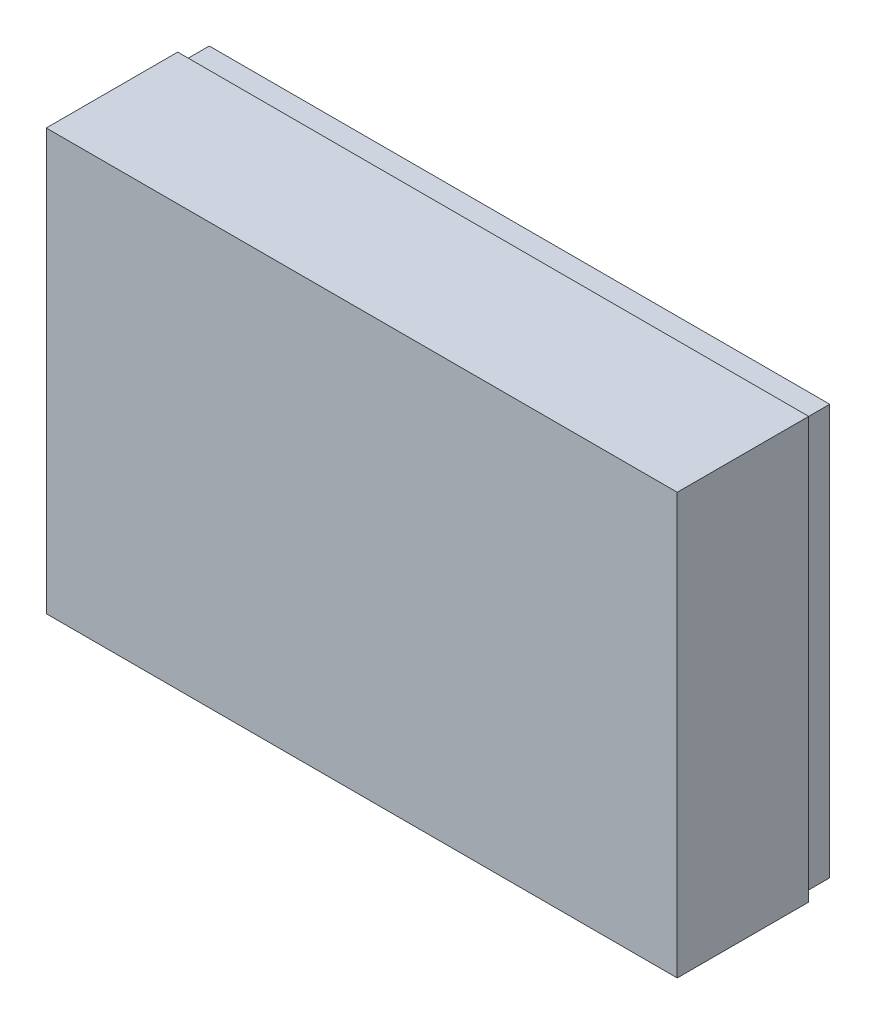
ISO-10303-21;
HEADER;
FILE_DESCRIPTION(('STEP AP214'),'2;1');
FILE_NAME('part.step','',(''),(''),'','','');
FILE_SCHEMA(('AUTOMOTIVE_DESIGN { 1 0 10303 214 1 1 1 1 }'));
ENDSEC;
DATA;
#1=APPLICATION_CONTEXT('core data for automotive mechanical design processes');
#2=APPLICATION_PROTOCOL_DEFINITION('international standard','automotive_design',2000,#1);
#3=PRODUCT_CONTEXT('',#1,'mechanical');
#4=PRODUCT('Part','Part','',(#3));
#5=PRODUCT_RELATED_PRODUCT_CATEGORY('part','',(#4));
#6=PRODUCT_DEFINITION_FORMATION('','',#4);
#7=PRODUCT_DEFINITION_CONTEXT('part definition',#1,'design');
#8=PRODUCT_DEFINITION('design','',#6,#7);
#9=PRODUCT_DEFINITION_SHAPE('','',#8);
#10=(LENGTH_UNIT() NAMED_UNIT(*) SI_UNIT(.MILLI.,.METRE.));
#11=(NAMED_UNIT(*) PLANE_ANGLE_UNIT() SI_UNIT($,.RADIAN.));
#12=(NAMED_UNIT(*) SI_UNIT($,.STERADIAN.) SOLID_ANGLE_UNIT());
#13=UNCERTAINTY_MEASURE_WITH_UNIT(LENGTH_MEASURE(1.E-05),#10,'distance_accuracy_value','');
#14=(GEOMETRIC_REPRESENTATION_CONTEXT(3) GLOBAL_UNCERTAINTY_ASSIGNED_CONTEXT((#13)) GLOBAL_UNIT_ASSIGNED_CONTEXT((#10,
#11,#12)) REPRESENTATION_CONTEXT('',''));
#15=CARTESIAN_POINT('',(0.,0.,0.));
#16=DIRECTION('',(0.,0.,1.));
#17=DIRECTION('',(1.,0.,0.));
#18=AXIS2_PLACEMENT_3D('',#15,#16,#17);
#19=CARTESIAN_POINT('',(0.,0.,0.));
#20=DIRECTION('',(0.,0.,-1.));
#21=DIRECTION('',(-1.,0.,0.));
#22=AXIS2_PLACEMENT_3D('',#19,#20,#21);
#23=PLANE('',#22);
#24=DIRECTION('',(-1.,0.,0.));
#25=VECTOR('',#24,1.);
#26=CARTESIAN_POINT('',(0.,38.,0.));
#27=LINE('',#26,#25);
#28=CARTESIAN_POINT('',(58.,38.,0.));
#29=VERTEX_POINT('',#28);
#30=CARTESIAN_POINT('',(-58.,38.,0.));
#31=VERTEX_POINT('',#30);
#32=EDGE_CURVE('E180',#29,#31,#27,.T.);
#33=ORIENTED_EDGE('',*,*,#32,.T.);
#34=DIRECTION('',(0.,-1.,0.));
#35=VECTOR('',#34,1.);
#36=CARTESIAN_POINT('',(-58.,0.,0.));
#37=LINE('',#36,#35);
#38=CARTESIAN_POINT('',(-58.,-38.,0.));
#39=VERTEX_POINT('',#38);
#40=EDGE_CURVE('E170',#31,#39,#37,.T.);
#41=ORIENTED_EDGE('',*,*,#40,.T.);
#42=DIRECTION('',(1.,0.,0.));
#43=VECTOR('',#42,1.);
#44=CARTESIAN_POINT('',(0.,-38.,0.));
#45=LINE('',#44,#43);
#46=CARTESIAN_POINT('',(58.,-38.,0.));
#47=VERTEX_POINT('',#46);
#48=EDGE_CURVE('E194',#39,#47,#45,.T.);
#49=ORIENTED_EDGE('',*,*,#48,.T.);
#50=DIRECTION('',(0.,1.,0.));
#51=VECTOR('',#50,1.);
#52=CARTESIAN_POINT('',(58.,0.,0.));
#53=LINE('',#52,#51);
#54=EDGE_CURVE('E197',#47,#29,#53,.T.);
#55=ORIENTED_EDGE('',*,*,#54,.T.);
#56=EDGE_LOOP('',(#33,#41,#49,#55));
#57=FACE_BOUND('',#56,.T.);
#58=DIRECTION('',(0.,-1.,0.));
#59=VECTOR('',#58,1.);
#60=CARTESIAN_POINT('',(59.,39.,0.));
#61=LINE('',#60,#59);
#62=CARTESIAN_POINT('',(59.,39.,0.));
#63=VERTEX_POINT('',#62);
#64=CARTESIAN_POINT('',(59.,-39.,0.));
#65=VERTEX_POINT('',#64);
#66=EDGE_CURVE('E148',#63,#65,#61,.T.);
#67=ORIENTED_EDGE('',*,*,#66,.T.);
#68=DIRECTION('',(-1.,0.,0.));
#69=VECTOR('',#68,1.);
#70=CARTESIAN_POINT('',(59.,-39.,0.));
#71=LINE('',#70,#69);
#72=CARTESIAN_POINT('',(-59.,-39.,0.));
#73=VERTEX_POINT('',#72);
#74=EDGE_CURVE('E155',#65,#73,#71,.T.);
#75=ORIENTED_EDGE('',*,*,#74,.T.);
#76=DIRECTION('',(0.,1.,0.));
#77=VECTOR('',#76,1.);
#78=CARTESIAN_POINT('',(-59.,-39.,0.));
#79=LINE('',#78,#77);
#80=CARTESIAN_POINT('',(-59.,39.,0.));
#81=VERTEX_POINT('',#80);
#82=EDGE_CURVE('E129',#73,#81,#79,.T.);
#83=ORIENTED_EDGE('',*,*,#82,.T.);
#84=DIRECTION('',(1.,0.,0.));
#85=VECTOR('',#84,1.);
#86=CARTESIAN_POINT('',(-59.,39.,0.));
#87=LINE('',#86,#85);
#88=EDGE_CURVE('E49',#81,#63,#87,.T.);
#89=ORIENTED_EDGE('',*,*,#88,.T.);
#90=EDGE_LOOP('',(#67,#75,#83,#89));
#91=FACE_BOUND('',#90,.T.);
#92=ADVANCED_FACE('F34',(#57,#91),#23,.T.);
#93=CARTESIAN_POINT('',(-58.,40.,30.));
#94=DIRECTION('',(1.,0.,0.));
#95=DIRECTION('',(0.,0.,-1.));
#96=AXIS2_PLACEMENT_3D('',#93,#94,#95);
#97=PLANE('',#96);
#98=ORIENTED_EDGE('',*,*,#40,.F.);
#99=DIRECTION('',(0.,0.,-1.));
#100=VECTOR('',#99,1.);
#101=CARTESIAN_POINT('',(-58.,38.,30.));
#102=LINE('',#101,#100);
#103=CARTESIAN_POINT('',(-58.,38.,28.));
#104=VERTEX_POINT('',#103);
#105=EDGE_CURVE('E181',#104,#31,#102,.T.);
#106=ORIENTED_EDGE('',*,*,#105,.F.);
#107=DIRECTION('',(0.,-1.,0.));
#108=VECTOR('',#107,1.);
#109=CARTESIAN_POINT('',(-58.,0.,28.));
#110=LINE('',#109,#108);
#111=CARTESIAN_POINT('',(-58.,-38.,28.));
#112=VERTEX_POINT('',#111);
#113=EDGE_CURVE('E176',#104,#112,#110,.T.);
#114=ORIENTED_EDGE('',*,*,#113,.T.);
#115=DIRECTION('',(0.,0.,-1.));
#116=VECTOR('',#115,1.);
#117=CARTESIAN_POINT('',(-58.,-38.,30.));
#118=LINE('',#117,#116);
#119=EDGE_CURVE('E171',#112,#39,#118,.T.);
#120=ORIENTED_EDGE('',*,*,#119,.T.);
#121=EDGE_LOOP('',(#98,#106,#114,#120));
#122=FACE_BOUND('',#121,.T.);
#123=ADVANCED_FACE('F247',(#122),#97,.T.);
#124=CARTESIAN_POINT('',(60.,-38.,30.));
#125=DIRECTION('',(0.,1.,0.));
#126=DIRECTION('',(-1.,0.,0.));
#127=AXIS2_PLACEMENT_3D('',#124,#125,#126);
#128=PLANE('',#127);
#129=ORIENTED_EDGE('',*,*,#48,.F.);
#130=ORIENTED_EDGE('',*,*,#119,.F.);
#131=DIRECTION('',(1.,0.,0.));
#132=VECTOR('',#131,1.);
#133=CARTESIAN_POINT('',(0.,-38.,28.));
#134=LINE('',#133,#132);
#135=CARTESIAN_POINT('',(58.,-38.,28.));
#136=VERTEX_POINT('',#135);
#137=EDGE_CURVE('E179',#112,#136,#134,.T.);
#138=ORIENTED_EDGE('',*,*,#137,.T.);
#139=DIRECTION('',(0.,0.,-1.));
#140=VECTOR('',#139,1.);
#141=CARTESIAN_POINT('',(58.,-38.,30.));
#142=LINE('',#141,#140);
#143=EDGE_CURVE('E175',#136,#47,#142,.T.);
#144=ORIENTED_EDGE('',*,*,#143,.T.);
#145=EDGE_LOOP('',(#129,#130,#138,#144));
#146=FACE_BOUND('',#145,.T.);
#147=ADVANCED_FACE('F253',(#146),#128,.T.);
#148=CARTESIAN_POINT('',(58.,40.,30.));
#149=DIRECTION('',(-1.,0.,0.));
#150=DIRECTION('',(0.,-1.,0.));
#151=AXIS2_PLACEMENT_3D('',#148,#149,#150);
#152=PLANE('',#151);
#153=ORIENTED_EDGE('',*,*,#54,.F.);
#154=ORIENTED_EDGE('',*,*,#143,.F.);
#155=DIRECTION('',(0.,1.,0.));
#156=VECTOR('',#155,1.);
#157=CARTESIAN_POINT('',(58.,0.,28.));
#158=LINE('',#157,#156);
#159=CARTESIAN_POINT('',(58.,38.,28.));
#160=VERTEX_POINT('',#159);
#161=EDGE_CURVE('E188',#136,#160,#158,.T.);
#162=ORIENTED_EDGE('',*,*,#161,.T.);
#163=DIRECTION('',(0.,0.,-1.));
#164=VECTOR('',#163,1.);
#165=CARTESIAN_POINT('',(58.,38.,30.));
#166=LINE('',#165,#164);
#167=EDGE_CURVE('E183',#160,#29,#166,.T.);
#168=ORIENTED_EDGE('',*,*,#167,.T.);
#169=EDGE_LOOP('',(#153,#154,#162,#168));
#170=FACE_BOUND('',#169,.T.);
#171=ADVANCED_FACE('F335',(#170),#152,.T.);
#172=CARTESIAN_POINT('',(60.,38.,30.));
#173=DIRECTION('',(0.,-1.,0.));
#174=DIRECTION('',(0.,0.,-1.));
#175=AXIS2_PLACEMENT_3D('',#172,#173,#174);
#176=PLANE('',#175);
#177=ORIENTED_EDGE('',*,*,#32,.F.);
#178=ORIENTED_EDGE('',*,*,#167,.F.);
#179=DIRECTION('',(-1.,0.,0.));
#180=VECTOR('',#179,1.);
#181=CARTESIAN_POINT('',(0.,38.,28.));
#182=LINE('',#181,#180);
#183=EDGE_CURVE('E184',#160,#104,#182,.T.);
#184=ORIENTED_EDGE('',*,*,#183,.T.);
#185=ORIENTED_EDGE('',*,*,#105,.T.);
#186=EDGE_LOOP('',(#177,#178,#184,#185));
#187=FACE_BOUND('',#186,.T.);
#188=ADVANCED_FACE('F329',(#187),#176,.T.);
#189=CARTESIAN_POINT('',(0.,0.,28.));
#190=DIRECTION('',(0.,0.,-1.));
#191=DIRECTION('',(-1.,0.,0.));
#192=AXIS2_PLACEMENT_3D('',#189,#190,#191);
#193=PLANE('',#192);
#194=ORIENTED_EDGE('',*,*,#113,.F.);
#195=ORIENTED_EDGE('',*,*,#183,.F.);
#196=ORIENTED_EDGE('',*,*,#161,.F.);
#197=ORIENTED_EDGE('',*,*,#137,.F.);
#198=EDGE_LOOP('',(#194,#195,#196,#197));
#199=FACE_BOUND('',#198,.T.);
#200=ADVANCED_FACE('F282',(#199),#193,.T.);
#201=CARTESIAN_POINT('',(0.,0.,5.));
#202=DIRECTION('',(0.,0.,-1.));
#203=DIRECTION('',(-1.,0.,0.));
#204=AXIS2_PLACEMENT_3D('',#201,#202,#203);
#205=PLANE('',#204);
#206=DIRECTION('',(0.,-1.,0.));
#207=VECTOR('',#206,1.);
#208=CARTESIAN_POINT('',(59.,39.,5.));
#209=LINE('',#208,#207);
#210=CARTESIAN_POINT('',(59.,39.,5.));
#211=VERTEX_POINT('',#210);
#212=CARTESIAN_POINT('',(59.,-39.,5.));
#213=VERTEX_POINT('',#212);
#214=EDGE_CURVE('E135',#211,#213,#209,.T.);
#215=ORIENTED_EDGE('',*,*,#214,.F.);
#216=DIRECTION('',(1.,0.,0.));
#217=VECTOR('',#216,1.);
#218=CARTESIAN_POINT('',(-59.,39.,5.));
#219=LINE('',#218,#217);
#220=CARTESIAN_POINT('',(-59.,39.,5.));
#221=VERTEX_POINT('',#220);
#222=EDGE_CURVE('E144',#221,#211,#219,.T.);
#223=ORIENTED_EDGE('',*,*,#222,.F.);
#224=DIRECTION('',(0.,1.,0.));
#225=VECTOR('',#224,1.);
#226=CARTESIAN_POINT('',(-59.,-39.,5.));
#227=LINE('',#226,#225);
#228=CARTESIAN_POINT('',(-59.,-39.,5.));
#229=VERTEX_POINT('',#228);
#230=EDGE_CURVE('E127',#229,#221,#227,.T.);
#231=ORIENTED_EDGE('',*,*,#230,.F.);
#232=DIRECTION('',(-1.,0.,0.));
#233=VECTOR('',#232,1.);
#234=CARTESIAN_POINT('',(59.,-39.,5.));
#235=LINE('',#234,#233);
#236=EDGE_CURVE('E141',#213,#229,#235,.T.);
#237=ORIENTED_EDGE('',*,*,#236,.F.);
#238=EDGE_LOOP('',(#215,#223,#231,#237));
#239=FACE_BOUND('',#238,.T.);
#240=DIRECTION('',(-1.,0.,0.));
#241=VECTOR('',#240,1.);
#242=CARTESIAN_POINT('',(60.,-40.,5.));
#243=LINE('',#242,#241);
#244=CARTESIAN_POINT('',(60.,-40.,5.));
#245=VERTEX_POINT('',#244);
#246=CARTESIAN_POINT('',(-60.,-40.,5.));
#247=VERTEX_POINT('',#246);
#248=EDGE_CURVE('E160',#245,#247,#243,.T.);
#249=ORIENTED_EDGE('',*,*,#248,.T.);
#250=DIRECTION('',(0.,1.,0.));
#251=VECTOR('',#250,1.);
#252=CARTESIAN_POINT('',(-60.,-40.,5.));
#253=LINE('',#252,#251);
#254=CARTESIAN_POINT('',(-60.,40.,5.));
#255=VERTEX_POINT('',#254);
#256=EDGE_CURVE('E57',#247,#255,#253,.T.);
#257=ORIENTED_EDGE('',*,*,#256,.T.);
#258=DIRECTION('',(1.,0.,0.));
#259=VECTOR('',#258,1.);
#260=CARTESIAN_POINT('',(-60.,40.,5.));
#261=LINE('',#260,#259);
#262=CARTESIAN_POINT('',(60.,40.,5.));
#263=VERTEX_POINT('',#262);
#264=EDGE_CURVE('E166',#255,#263,#261,.T.);
#265=ORIENTED_EDGE('',*,*,#264,.T.);
#266=DIRECTION('',(0.,-1.,0.));
#267=VECTOR('',#266,1.);
#268=CARTESIAN_POINT('',(60.,40.,5.));
#269=LINE('',#268,#267);
#270=EDGE_CURVE('E168',#263,#245,#269,.T.);
#271=ORIENTED_EDGE('',*,*,#270,.T.);
#272=EDGE_LOOP('',(#249,#257,#265,#271));
#273=FACE_BOUND('',#272,.T.);
#274=ADVANCED_FACE('F140',(#239,#273),#205,.T.);
#275=CARTESIAN_POINT('',(59.,-39.,5.));
#276=DIRECTION('',(0.,-1.,0.));
#277=DIRECTION('',(0.,0.,-1.));
#278=AXIS2_PLACEMENT_3D('',#275,#276,#277);
#279=PLANE('',#278);
#280=ORIENTED_EDGE('',*,*,#74,.F.);
#281=DIRECTION('',(0.,0.,-1.));
#282=VECTOR('',#281,1.);
#283=CARTESIAN_POINT('',(59.,-39.,5.));
#284=LINE('',#283,#282);
#285=EDGE_CURVE('E147',#213,#65,#284,.T.);
#286=ORIENTED_EDGE('',*,*,#285,.F.);
#287=ORIENTED_EDGE('',*,*,#236,.T.);
#288=DIRECTION('',(0.,0.,-1.));
#289=VECTOR('',#288,1.);
#290=CARTESIAN_POINT('',(-59.,-39.,5.));
#291=LINE('',#290,#289);
#292=EDGE_CURVE('E124',#229,#73,#291,.T.);
#293=ORIENTED_EDGE('',*,*,#292,.T.);
#294=EDGE_LOOP('',(#280,#286,#287,#293));
#295=FACE_BOUND('',#294,.T.);
#296=ADVANCED_FACE('F146',(#295),#279,.T.);
#297=CARTESIAN_POINT('',(59.,39.,5.));
#298=DIRECTION('',(1.,0.,0.));
#299=DIRECTION('',(0.,0.,-1.));
#300=AXIS2_PLACEMENT_3D('',#297,#298,#299);
#301=PLANE('',#300);
#302=ORIENTED_EDGE('',*,*,#66,.F.);
#303=DIRECTION('',(0.,0.,-1.));
#304=VECTOR('',#303,1.);
#305=CARTESIAN_POINT('',(59.,39.,5.));
#306=LINE('',#305,#304);
#307=EDGE_CURVE('E161',#211,#63,#306,.T.);
#308=ORIENTED_EDGE('',*,*,#307,.F.);
#309=ORIENTED_EDGE('',*,*,#214,.T.);
#310=ORIENTED_EDGE('',*,*,#285,.T.);
#311=EDGE_LOOP('',(#302,#308,#309,#310));
#312=FACE_BOUND('',#311,.T.);
#313=ADVANCED_FACE('F290',(#312),#301,.T.);
#314=CARTESIAN_POINT('',(-59.,39.,5.));
#315=DIRECTION('',(0.,1.,0.));
#316=DIRECTION('',(0.,0.,1.));
#317=AXIS2_PLACEMENT_3D('',#314,#315,#316);
#318=PLANE('',#317);
#319=ORIENTED_EDGE('',*,*,#88,.F.);
#320=DIRECTION('',(0.,0.,-1.));
#321=VECTOR('',#320,1.);
#322=CARTESIAN_POINT('',(-59.,39.,5.));
#323=LINE('',#322,#321);
#324=EDGE_CURVE('E134',#221,#81,#323,.T.);
#325=ORIENTED_EDGE('',*,*,#324,.F.);
#326=ORIENTED_EDGE('',*,*,#222,.T.);
#327=ORIENTED_EDGE('',*,*,#307,.T.);
#328=EDGE_LOOP('',(#319,#325,#326,#327));
#329=FACE_BOUND('',#328,.T.);
#330=ADVANCED_FACE('F242',(#329),#318,.T.);
#331=CARTESIAN_POINT('',(-59.,-39.,5.));
#332=DIRECTION('',(-1.,0.,0.));
#333=DIRECTION('',(0.,0.,1.));
#334=AXIS2_PLACEMENT_3D('',#331,#332,#333);
#335=PLANE('',#334);
#336=ORIENTED_EDGE('',*,*,#82,.F.);
#337=ORIENTED_EDGE('',*,*,#292,.F.);
#338=ORIENTED_EDGE('',*,*,#230,.T.);
#339=ORIENTED_EDGE('',*,*,#324,.T.);
#340=EDGE_LOOP('',(#336,#337,#338,#339));
#341=FACE_BOUND('',#340,.T.);
#342=ADVANCED_FACE('F126',(#341),#335,.T.);
#343=CARTESIAN_POINT('',(0.,0.,30.));
#344=DIRECTION('',(0.,0.,-1.));
#345=DIRECTION('',(-1.,0.,0.));
#346=AXIS2_PLACEMENT_3D('',#343,#344,#345);
#347=PLANE('',#346);
#348=DIRECTION('',(0.,-1.,0.));
#349=VECTOR('',#348,1.);
#350=CARTESIAN_POINT('',(-60.,40.,30.));
#351=LINE('',#350,#349);
#352=CARTESIAN_POINT('',(-60.,40.,30.));
#353=VERTEX_POINT('',#352);
#354=CARTESIAN_POINT('',(-60.,-40.,30.));
#355=VERTEX_POINT('',#354);
#356=EDGE_CURVE('E174',#353,#355,#351,.T.);
#357=ORIENTED_EDGE('',*,*,#356,.T.);
#358=DIRECTION('',(1.,0.,0.));
#359=VECTOR('',#358,1.);
#360=CARTESIAN_POINT('',(60.,-40.,30.));
#361=LINE('',#360,#359);
#362=CARTESIAN_POINT('',(60.,-40.,30.));
#363=VERTEX_POINT('',#362);
#364=EDGE_CURVE('E204',#355,#363,#361,.T.);
#365=ORIENTED_EDGE('',*,*,#364,.T.);
#366=DIRECTION('',(0.,1.,0.));
#367=VECTOR('',#366,1.);
#368=CARTESIAN_POINT('',(60.,40.,30.));
#369=LINE('',#368,#367);
#370=CARTESIAN_POINT('',(60.,40.,30.));
#371=VERTEX_POINT('',#370);
#372=EDGE_CURVE('E206',#363,#371,#369,.T.);
#373=ORIENTED_EDGE('',*,*,#372,.T.);
#374=DIRECTION('',(-1.,0.,0.));
#375=VECTOR('',#374,1.);
#376=CARTESIAN_POINT('',(60.,40.,30.));
#377=LINE('',#376,#375);
#378=EDGE_CURVE('E208',#371,#353,#377,.T.);
#379=ORIENTED_EDGE('',*,*,#378,.T.);
#380=EDGE_LOOP('',(#357,#365,#373,#379));
#381=FACE_BOUND('',#380,.T.);
#382=ADVANCED_FACE('F233',(#381),#347,.F.);
#383=CARTESIAN_POINT('',(60.,40.,30.));
#384=DIRECTION('',(0.,-1.,0.));
#385=DIRECTION('',(0.,0.,-1.));
#386=AXIS2_PLACEMENT_3D('',#383,#384,#385);
#387=PLANE('',#386);
#388=ORIENTED_EDGE('',*,*,#264,.F.);
#389=DIRECTION('',(0.,0.,-1.));
#390=VECTOR('',#389,1.);
#391=CARTESIAN_POINT('',(-60.,40.,30.));
#392=LINE('',#391,#390);
#393=EDGE_CURVE('E210',#353,#255,#392,.T.);
#394=ORIENTED_EDGE('',*,*,#393,.F.);
#395=ORIENTED_EDGE('',*,*,#378,.F.);
#396=DIRECTION('',(0.,0.,-1.));
#397=VECTOR('',#396,1.);
#398=CARTESIAN_POINT('',(60.,40.,30.));
#399=LINE('',#398,#397);
#400=EDGE_CURVE('E213',#371,#263,#399,.T.);
#401=ORIENTED_EDGE('',*,*,#400,.T.);
#402=EDGE_LOOP('',(#388,#394,#395,#401));
#403=FACE_BOUND('',#402,.T.);
#404=ADVANCED_FACE('F231',(#403),#387,.F.);
#405=CARTESIAN_POINT('',(60.,40.,30.));
#406=DIRECTION('',(-1.,0.,0.));
#407=DIRECTION('',(0.,-1.,0.));
#408=AXIS2_PLACEMENT_3D('',#405,#406,#407);
#409=PLANE('',#408);
#410=ORIENTED_EDGE('',*,*,#270,.F.);
#411=ORIENTED_EDGE('',*,*,#400,.F.);
#412=ORIENTED_EDGE('',*,*,#372,.F.);
#413=DIRECTION('',(0.,0.,-1.));
#414=VECTOR('',#413,1.);
#415=CARTESIAN_POINT('',(60.,-40.,30.));
#416=LINE('',#415,#414);
#417=EDGE_CURVE('E42',#363,#245,#416,.T.);
#418=ORIENTED_EDGE('',*,*,#417,.T.);
#419=EDGE_LOOP('',(#410,#411,#412,#418));
#420=FACE_BOUND('',#419,.T.);
#421=ADVANCED_FACE('F220',(#420),#409,.F.);
#422=CARTESIAN_POINT('',(60.,-40.,30.));
#423=DIRECTION('',(0.,1.,0.));
#424=DIRECTION('',(-1.,0.,0.));
#425=AXIS2_PLACEMENT_3D('',#422,#423,#424);
#426=PLANE('',#425);
#427=ORIENTED_EDGE('',*,*,#248,.F.);
#428=ORIENTED_EDGE('',*,*,#417,.F.);
#429=ORIENTED_EDGE('',*,*,#364,.F.);
#430=DIRECTION('',(0.,0.,-1.));
#431=VECTOR('',#430,1.);
#432=CARTESIAN_POINT('',(-60.,-40.,30.));
#433=LINE('',#432,#431);
#434=EDGE_CURVE('E11',#355,#247,#433,.T.);
#435=ORIENTED_EDGE('',*,*,#434,.T.);
#436=EDGE_LOOP('',(#427,#428,#429,#435));
#437=FACE_BOUND('',#436,.T.);
#438=ADVANCED_FACE('F224',(#437),#426,.F.);
#439=CARTESIAN_POINT('',(-60.,40.,30.));
#440=DIRECTION('',(1.,0.,0.));
#441=DIRECTION('',(0.,0.,-1.));
#442=AXIS2_PLACEMENT_3D('',#439,#440,#441);
#443=PLANE('',#442);
#444=ORIENTED_EDGE('',*,*,#256,.F.);
#445=ORIENTED_EDGE('',*,*,#434,.F.);
#446=ORIENTED_EDGE('',*,*,#356,.F.);
#447=ORIENTED_EDGE('',*,*,#393,.T.);
#448=EDGE_LOOP('',(#444,#445,#446,#447));
#449=FACE_BOUND('',#448,.T.);
#450=ADVANCED_FACE('F36',(#449),#443,.F.);
#451=CLOSED_SHELL('',(#92,#123,#147,#171,#188,#200,#274,#296,#313,#330,#342,#382,#404,#421,#438,#450));
#452=MANIFOLD_SOLID_BREP('B2',#451);
#453=ADVANCED_BREP_SHAPE_REPRESENTATION('',(#18,#452),#14);
#454=SHAPE_DEFINITION_REPRESENTATION(#9,#453);
ENDSEC;
END-ISO-10303-21;
